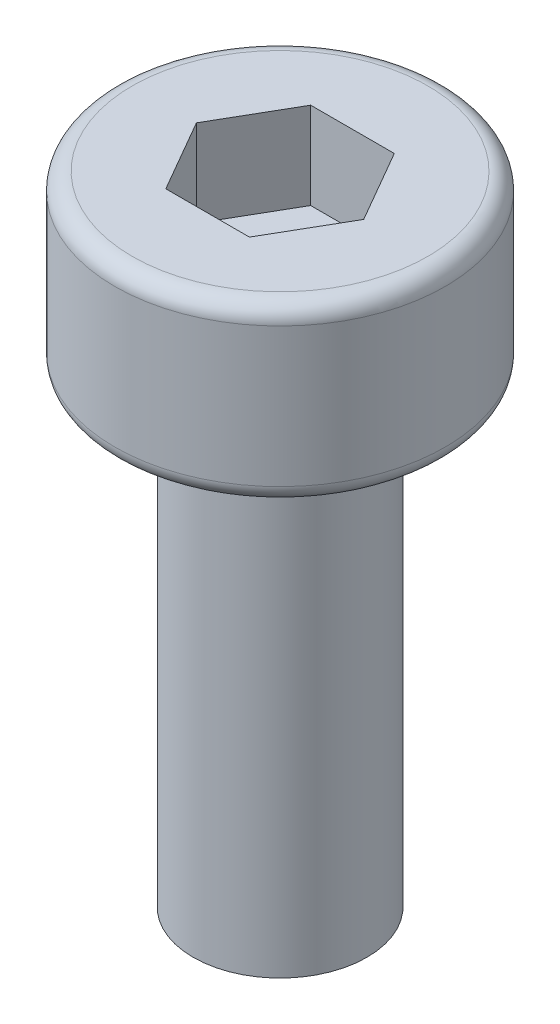
ISO-10303-21;
HEADER;
FILE_DESCRIPTION(('STEP AP214'),'2;1');
FILE_NAME('part.step','',(''),(''),'','','');
FILE_SCHEMA(('AUTOMOTIVE_DESIGN { 1 0 10303 214 1 1 1 1 }'));
ENDSEC;
DATA;
#1=APPLICATION_CONTEXT('core data for automotive mechanical design processes');
#2=APPLICATION_PROTOCOL_DEFINITION('international standard','automotive_design',2000,#1);
#3=PRODUCT_CONTEXT('',#1,'mechanical');
#4=PRODUCT('Part','Part','',(#3));
#5=PRODUCT_RELATED_PRODUCT_CATEGORY('part','',(#4));
#6=PRODUCT_DEFINITION_FORMATION('','',#4);
#7=PRODUCT_DEFINITION_CONTEXT('part definition',#1,'design');
#8=PRODUCT_DEFINITION('design','',#6,#7);
#9=PRODUCT_DEFINITION_SHAPE('','',#8);
#10=(LENGTH_UNIT() NAMED_UNIT(*) SI_UNIT(.MILLI.,.METRE.));
#11=(NAMED_UNIT(*) PLANE_ANGLE_UNIT() SI_UNIT($,.RADIAN.));
#12=(NAMED_UNIT(*) SI_UNIT($,.STERADIAN.) SOLID_ANGLE_UNIT());
#13=UNCERTAINTY_MEASURE_WITH_UNIT(LENGTH_MEASURE(1.E-05),#10,'distance_accuracy_value','');
#14=(GEOMETRIC_REPRESENTATION_CONTEXT(3) GLOBAL_UNCERTAINTY_ASSIGNED_CONTEXT((#13)) GLOBAL_UNIT_ASSIGNED_CONTEXT((#10,
#11,#12)) REPRESENTATION_CONTEXT('',''));
#15=CARTESIAN_POINT('',(0.,0.,0.));
#16=DIRECTION('',(0.,0.,1.));
#17=DIRECTION('',(1.,0.,0.));
#18=AXIS2_PLACEMENT_3D('',#15,#16,#17);
#19=CARTESIAN_POINT('',(0.,3.,0.));
#20=DIRECTION('',(0.,-1.,0.));
#21=DIRECTION('',(0.,0.,-1.));
#22=AXIS2_PLACEMENT_3D('',#19,#20,#21);
#23=CYLINDRICAL_SURFACE('',#22,2.85);
#24=CARTESIAN_POINT('',(0.,0.3,0.));
#25=DIRECTION('',(0.,1.,0.));
#26=DIRECTION('',(0.,0.,1.));
#27=AXIS2_PLACEMENT_3D('',#24,#25,#26);
#28=CIRCLE('',#27,2.85);
#29=CARTESIAN_POINT('',(0.,0.3,2.85));
#30=VERTEX_POINT('',#29);
#31=EDGE_CURVE('E152',#30,#30,#28,.T.);
#32=ORIENTED_EDGE('',*,*,#31,.T.);
#33=EDGE_LOOP('',(#32));
#34=FACE_BOUND('',#33,.T.);
#35=CARTESIAN_POINT('',(0.,2.7,0.));
#36=DIRECTION('',(0.,1.,0.));
#37=DIRECTION('',(0.,0.,1.));
#38=AXIS2_PLACEMENT_3D('',#35,#36,#37);
#39=CIRCLE('',#38,2.85);
#40=CARTESIAN_POINT('',(0.,2.7,2.85));
#41=VERTEX_POINT('',#40);
#42=EDGE_CURVE('E149',#41,#41,#39,.F.);
#43=ORIENTED_EDGE('',*,*,#42,.T.);
#44=EDGE_LOOP('',(#43));
#45=FACE_BOUND('',#44,.T.);
#46=ADVANCED_FACE('F36',(#34,#45),#23,.T.);
#47=CARTESIAN_POINT('',(0.,3.,0.));
#48=DIRECTION('',(0.,1.,0.));
#49=DIRECTION('',(0.,0.,1.));
#50=AXIS2_PLACEMENT_3D('',#47,#48,#49);
#51=PLANE('',#50);
#52=DIRECTION('',(-0.5,0.,0.866025403784439));
#53=VECTOR('',#52,1.);
#54=CARTESIAN_POINT('',(-0.721687836487033,3.,-1.25));
#55=LINE('',#54,#53);
#56=CARTESIAN_POINT('',(-0.721687836487033,3.,-1.25));
#57=VERTEX_POINT('',#56);
#58=CARTESIAN_POINT('',(-1.44337567297406,3.,0.));
#59=VERTEX_POINT('',#58);
#60=EDGE_CURVE('E51',#57,#59,#55,.T.);
#61=ORIENTED_EDGE('',*,*,#60,.F.);
#62=DIRECTION('',(-1.,0.,0.));
#63=VECTOR('',#62,1.);
#64=CARTESIAN_POINT('',(0.721687836487032,3.,-1.25));
#65=LINE('',#64,#63);
#66=CARTESIAN_POINT('',(0.721687836487032,3.,-1.25));
#67=VERTEX_POINT('',#66);
#68=EDGE_CURVE('E134',#67,#57,#65,.T.);
#69=ORIENTED_EDGE('',*,*,#68,.F.);
#70=DIRECTION('',(-0.5,0.,-0.866025403784439));
#71=VECTOR('',#70,1.);
#72=CARTESIAN_POINT('',(1.44337567297406,3.,0.));
#73=LINE('',#72,#71);
#74=CARTESIAN_POINT('',(1.44337567297406,3.,0.));
#75=VERTEX_POINT('',#74);
#76=EDGE_CURVE('E132',#75,#67,#73,.T.);
#77=ORIENTED_EDGE('',*,*,#76,.F.);
#78=DIRECTION('',(0.5,0.,-0.866025403784439));
#79=VECTOR('',#78,1.);
#80=CARTESIAN_POINT('',(0.721687836487033,3.,1.25));
#81=LINE('',#80,#79);
#82=CARTESIAN_POINT('',(0.721687836487033,3.,1.25));
#83=VERTEX_POINT('',#82);
#84=EDGE_CURVE('E99',#83,#75,#81,.T.);
#85=ORIENTED_EDGE('',*,*,#84,.F.);
#86=DIRECTION('',(1.,0.,0.));
#87=VECTOR('',#86,1.);
#88=CARTESIAN_POINT('',(-0.721687836487032,3.,1.25));
#89=LINE('',#88,#87);
#90=CARTESIAN_POINT('',(-0.721687836487032,3.,1.25));
#91=VERTEX_POINT('',#90);
#92=EDGE_CURVE('E128',#91,#83,#89,.T.);
#93=ORIENTED_EDGE('',*,*,#92,.F.);
#94=DIRECTION('',(0.5,0.,0.866025403784439));
#95=VECTOR('',#94,1.);
#96=CARTESIAN_POINT('',(-1.44337567297406,3.,0.));
#97=LINE('',#96,#95);
#98=EDGE_CURVE('E125',#59,#91,#97,.T.);
#99=ORIENTED_EDGE('',*,*,#98,.F.);
#100=EDGE_LOOP('',(#61,#69,#77,#85,#93,#99));
#101=FACE_BOUND('',#100,.T.);
#102=CARTESIAN_POINT('',(0.,3.,0.));
#103=DIRECTION('',(0.,1.,0.));
#104=DIRECTION('',(0.,0.,1.));
#105=AXIS2_PLACEMENT_3D('',#102,#103,#104);
#106=CIRCLE('',#105,2.55);
#107=CARTESIAN_POINT('',(0.,3.,2.55));
#108=VERTEX_POINT('',#107);
#109=EDGE_CURVE('E11',#108,#108,#106,.T.);
#110=ORIENTED_EDGE('',*,*,#109,.T.);
#111=EDGE_LOOP('',(#110));
#112=FACE_BOUND('',#111,.T.);
#113=ADVANCED_FACE('F168',(#101,#112),#51,.T.);
#114=CARTESIAN_POINT('',(0.,0.,0.));
#115=DIRECTION('',(0.,1.,0.));
#116=DIRECTION('',(0.,0.,1.));
#117=AXIS2_PLACEMENT_3D('',#114,#115,#116);
#118=PLANE('',#117);
#119=CARTESIAN_POINT('',(0.,0.,0.));
#120=DIRECTION('',(0.,1.,0.));
#121=DIRECTION('',(0.,0.,1.));
#122=AXIS2_PLACEMENT_3D('',#119,#120,#121);
#123=CIRCLE('',#122,2.55);
#124=CARTESIAN_POINT('',(0.,0.,2.55));
#125=VERTEX_POINT('',#124);
#126=EDGE_CURVE('E44',#125,#125,#123,.F.);
#127=ORIENTED_EDGE('',*,*,#126,.T.);
#128=EDGE_LOOP('',(#127));
#129=FACE_BOUND('',#128,.T.);
#130=CARTESIAN_POINT('',(0.,0.,0.));
#131=DIRECTION('',(0.,1.,0.));
#132=DIRECTION('',(0.,0.,1.));
#133=AXIS2_PLACEMENT_3D('',#130,#131,#132);
#134=CIRCLE('',#133,1.5);
#135=CARTESIAN_POINT('',(0.,0.,1.5));
#136=VERTEX_POINT('',#135);
#137=EDGE_CURVE('E146',#136,#136,#134,.F.);
#138=ORIENTED_EDGE('',*,*,#137,.F.);
#139=EDGE_LOOP('',(#138));
#140=FACE_BOUND('',#139,.T.);
#141=ADVANCED_FACE('F157',(#129,#140),#118,.F.);
#142=CARTESIAN_POINT('',(0.,-8.,0.));
#143=DIRECTION('',(0.,1.,0.));
#144=DIRECTION('',(0.,0.,1.));
#145=AXIS2_PLACEMENT_3D('',#142,#143,#144);
#146=CYLINDRICAL_SURFACE('',#145,1.5);
#147=CARTESIAN_POINT('',(0.,-8.,0.));
#148=DIRECTION('',(0.,-1.,0.));
#149=DIRECTION('',(0.,0.,-1.));
#150=AXIS2_PLACEMENT_3D('',#147,#148,#149);
#151=CIRCLE('',#150,1.5);
#152=CARTESIAN_POINT('',(0.,-8.,-1.5));
#153=VERTEX_POINT('',#152);
#154=EDGE_CURVE('E138',#153,#153,#151,.T.);
#155=ORIENTED_EDGE('',*,*,#154,.F.);
#156=EDGE_LOOP('',(#155));
#157=FACE_BOUND('',#156,.T.);
#158=ORIENTED_EDGE('',*,*,#137,.T.);
#159=EDGE_LOOP('',(#158));
#160=FACE_BOUND('',#159,.T.);
#161=ADVANCED_FACE('F183',(#157,#160),#146,.T.);
#162=CARTESIAN_POINT('',(0.,-8.,0.));
#163=DIRECTION('',(0.,-1.,0.));
#164=DIRECTION('',(0.,0.,-1.));
#165=AXIS2_PLACEMENT_3D('',#162,#163,#164);
#166=PLANE('',#165);
#167=ORIENTED_EDGE('',*,*,#154,.T.);
#168=EDGE_LOOP('',(#167));
#169=FACE_BOUND('',#168,.T.);
#170=ADVANCED_FACE('F163',(#169),#166,.T.);
#171=CARTESIAN_POINT('',(0.,0.3,0.));
#172=DIRECTION('',(0.,1.,0.));
#173=DIRECTION('',(0.,0.,1.));
#174=AXIS2_PLACEMENT_3D('',#171,#172,#173);
#175=TOROIDAL_SURFACE('',#174,2.55,0.3);
#176=ORIENTED_EDGE('',*,*,#126,.F.);
#177=EDGE_LOOP('',(#176));
#178=FACE_BOUND('',#177,.T.);
#179=ORIENTED_EDGE('',*,*,#31,.F.);
#180=EDGE_LOOP('',(#179));
#181=FACE_BOUND('',#180,.T.);
#182=ADVANCED_FACE('F160',(#178,#181),#175,.T.);
#183=CARTESIAN_POINT('',(0.,2.7,0.));
#184=DIRECTION('',(0.,1.,0.));
#185=DIRECTION('',(0.,0.,1.));
#186=AXIS2_PLACEMENT_3D('',#183,#184,#185);
#187=TOROIDAL_SURFACE('',#186,2.55,0.3);
#188=ORIENTED_EDGE('',*,*,#42,.F.);
#189=EDGE_LOOP('',(#188));
#190=FACE_BOUND('',#189,.T.);
#191=ORIENTED_EDGE('',*,*,#109,.F.);
#192=EDGE_LOOP('',(#191));
#193=FACE_BOUND('',#192,.T.);
#194=ADVANCED_FACE('F38',(#190,#193),#187,.T.);
#195=CARTESIAN_POINT('',(-0.721687836487033,1.5,-1.25));
#196=DIRECTION('',(-0.866025403784439,0.,-0.5));
#197=DIRECTION('',(-0.5,0.,0.866025403784439));
#198=AXIS2_PLACEMENT_3D('',#195,#196,#197);
#199=PLANE('',#198);
#200=ORIENTED_EDGE('',*,*,#60,.T.);
#201=DIRECTION('',(0.,1.,0.));
#202=VECTOR('',#201,1.);
#203=CARTESIAN_POINT('',(-1.44337567297406,1.5,0.));
#204=LINE('',#203,#202);
#205=CARTESIAN_POINT('',(-1.44337567297406,1.5,0.));
#206=VERTEX_POINT('',#205);
#207=EDGE_CURVE('E81',#206,#59,#204,.T.);
#208=ORIENTED_EDGE('',*,*,#207,.F.);
#209=DIRECTION('',(-0.5,0.,0.866025403784439));
#210=VECTOR('',#209,1.);
#211=CARTESIAN_POINT('',(-0.721687836487033,1.5,-1.25));
#212=LINE('',#211,#210);
#213=CARTESIAN_POINT('',(-0.721687836487033,1.5,-1.25));
#214=VERTEX_POINT('',#213);
#215=EDGE_CURVE('E136',#214,#206,#212,.T.);
#216=ORIENTED_EDGE('',*,*,#215,.F.);
#217=DIRECTION('',(0.,1.,0.));
#218=VECTOR('',#217,1.);
#219=CARTESIAN_POINT('',(-0.721687836487033,1.5,-1.25));
#220=LINE('',#219,#218);
#221=EDGE_CURVE('E59',#214,#57,#220,.T.);
#222=ORIENTED_EDGE('',*,*,#221,.T.);
#223=EDGE_LOOP('',(#200,#208,#216,#222));
#224=FACE_BOUND('',#223,.T.);
#225=ADVANCED_FACE('F174',(#224),#199,.F.);
#226=CARTESIAN_POINT('',(0.721687836487032,1.5,-1.25));
#227=DIRECTION('',(0.,0.,-1.));
#228=DIRECTION('',(-1.,0.,0.));
#229=AXIS2_PLACEMENT_3D('',#226,#227,#228);
#230=PLANE('',#229);
#231=ORIENTED_EDGE('',*,*,#68,.T.);
#232=ORIENTED_EDGE('',*,*,#221,.F.);
#233=DIRECTION('',(-1.,0.,0.));
#234=VECTOR('',#233,1.);
#235=CARTESIAN_POINT('',(0.721687836487032,1.5,-1.25));
#236=LINE('',#235,#234);
#237=CARTESIAN_POINT('',(0.721687836487032,1.5,-1.25));
#238=VERTEX_POINT('',#237);
#239=EDGE_CURVE('E111',#238,#214,#236,.T.);
#240=ORIENTED_EDGE('',*,*,#239,.F.);
#241=DIRECTION('',(0.,1.,0.));
#242=VECTOR('',#241,1.);
#243=CARTESIAN_POINT('',(0.721687836487032,1.5,-1.25));
#244=LINE('',#243,#242);
#245=EDGE_CURVE('E103',#238,#67,#244,.T.);
#246=ORIENTED_EDGE('',*,*,#245,.T.);
#247=EDGE_LOOP('',(#231,#232,#240,#246));
#248=FACE_BOUND('',#247,.T.);
#249=ADVANCED_FACE('F194',(#248),#230,.F.);
#250=CARTESIAN_POINT('',(1.44337567297406,1.5,0.));
#251=DIRECTION('',(0.866025403784438,0.,-0.5));
#252=DIRECTION('',(-0.5,0.,-0.866025403784439));
#253=AXIS2_PLACEMENT_3D('',#250,#251,#252);
#254=PLANE('',#253);
#255=ORIENTED_EDGE('',*,*,#76,.T.);
#256=ORIENTED_EDGE('',*,*,#245,.F.);
#257=DIRECTION('',(-0.5,0.,-0.866025403784439));
#258=VECTOR('',#257,1.);
#259=CARTESIAN_POINT('',(1.44337567297406,1.5,0.));
#260=LINE('',#259,#258);
#261=CARTESIAN_POINT('',(1.44337567297406,1.5,0.));
#262=VERTEX_POINT('',#261);
#263=EDGE_CURVE('E107',#262,#238,#260,.T.);
#264=ORIENTED_EDGE('',*,*,#263,.F.);
#265=DIRECTION('',(0.,1.,0.));
#266=VECTOR('',#265,1.);
#267=CARTESIAN_POINT('',(1.44337567297406,1.5,0.));
#268=LINE('',#267,#266);
#269=EDGE_CURVE('E92',#262,#75,#268,.T.);
#270=ORIENTED_EDGE('',*,*,#269,.T.);
#271=EDGE_LOOP('',(#255,#256,#264,#270));
#272=FACE_BOUND('',#271,.T.);
#273=ADVANCED_FACE('F108',(#272),#254,.F.);
#274=CARTESIAN_POINT('',(0.721687836487033,1.5,1.25));
#275=DIRECTION('',(0.866025403784439,0.,0.5));
#276=DIRECTION('',(0.5,0.,-0.866025403784439));
#277=AXIS2_PLACEMENT_3D('',#274,#275,#276);
#278=PLANE('',#277);
#279=ORIENTED_EDGE('',*,*,#84,.T.);
#280=ORIENTED_EDGE('',*,*,#269,.F.);
#281=DIRECTION('',(0.5,0.,-0.866025403784439));
#282=VECTOR('',#281,1.);
#283=CARTESIAN_POINT('',(0.721687836487033,1.5,1.25));
#284=LINE('',#283,#282);
#285=CARTESIAN_POINT('',(0.721687836487033,1.5,1.25));
#286=VERTEX_POINT('',#285);
#287=EDGE_CURVE('E96',#286,#262,#284,.T.);
#288=ORIENTED_EDGE('',*,*,#287,.F.);
#289=DIRECTION('',(0.,1.,0.));
#290=VECTOR('',#289,1.);
#291=CARTESIAN_POINT('',(0.721687836487033,1.5,1.25));
#292=LINE('',#291,#290);
#293=EDGE_CURVE('E104',#286,#83,#292,.T.);
#294=ORIENTED_EDGE('',*,*,#293,.T.);
#295=EDGE_LOOP('',(#279,#280,#288,#294));
#296=FACE_BOUND('',#295,.T.);
#297=ADVANCED_FACE('F94',(#296),#278,.F.);
#298=CARTESIAN_POINT('',(-0.721687836487032,1.5,1.25));
#299=DIRECTION('',(0.,0.,1.));
#300=DIRECTION('',(1.,0.,0.));
#301=AXIS2_PLACEMENT_3D('',#298,#299,#300);
#302=PLANE('',#301);
#303=ORIENTED_EDGE('',*,*,#92,.T.);
#304=ORIENTED_EDGE('',*,*,#293,.F.);
#305=DIRECTION('',(1.,0.,0.));
#306=VECTOR('',#305,1.);
#307=CARTESIAN_POINT('',(-0.721687836487032,1.5,1.25));
#308=LINE('',#307,#306);
#309=CARTESIAN_POINT('',(-0.721687836487032,1.5,1.25));
#310=VERTEX_POINT('',#309);
#311=EDGE_CURVE('E117',#310,#286,#308,.T.);
#312=ORIENTED_EDGE('',*,*,#311,.F.);
#313=DIRECTION('',(0.,1.,0.));
#314=VECTOR('',#313,1.);
#315=CARTESIAN_POINT('',(-0.721687836487032,1.5,1.25));
#316=LINE('',#315,#314);
#317=EDGE_CURVE('E141',#310,#91,#316,.T.);
#318=ORIENTED_EDGE('',*,*,#317,.T.);
#319=EDGE_LOOP('',(#303,#304,#312,#318));
#320=FACE_BOUND('',#319,.T.);
#321=ADVANCED_FACE('F198',(#320),#302,.F.);
#322=CARTESIAN_POINT('',(-1.44337567297406,1.5,0.));
#323=DIRECTION('',(-0.866025403784439,0.,0.5));
#324=DIRECTION('',(0.5,0.,0.866025403784439));
#325=AXIS2_PLACEMENT_3D('',#322,#323,#324);
#326=PLANE('',#325);
#327=ORIENTED_EDGE('',*,*,#98,.T.);
#328=ORIENTED_EDGE('',*,*,#317,.F.);
#329=DIRECTION('',(0.5,0.,0.866025403784439));
#330=VECTOR('',#329,1.);
#331=CARTESIAN_POINT('',(-1.44337567297406,1.5,0.));
#332=LINE('',#331,#330);
#333=EDGE_CURVE('E119',#206,#310,#332,.T.);
#334=ORIENTED_EDGE('',*,*,#333,.F.);
#335=ORIENTED_EDGE('',*,*,#207,.T.);
#336=EDGE_LOOP('',(#327,#328,#334,#335));
#337=FACE_BOUND('',#336,.T.);
#338=ADVANCED_FACE('F195',(#337),#326,.F.);
#339=CARTESIAN_POINT('',(0.,1.5,0.));
#340=DIRECTION('',(0.,1.,0.));
#341=DIRECTION('',(0.,0.,1.));
#342=AXIS2_PLACEMENT_3D('',#339,#340,#341);
#343=PLANE('',#342);
#344=ORIENTED_EDGE('',*,*,#215,.T.);
#345=ORIENTED_EDGE('',*,*,#333,.T.);
#346=ORIENTED_EDGE('',*,*,#311,.T.);
#347=ORIENTED_EDGE('',*,*,#287,.T.);
#348=ORIENTED_EDGE('',*,*,#263,.T.);
#349=ORIENTED_EDGE('',*,*,#239,.T.);
#350=EDGE_LOOP('',(#344,#345,#346,#347,#348,#349));
#351=FACE_BOUND('',#350,.T.);
#352=ADVANCED_FACE('F114',(#351),#343,.T.);
#353=CLOSED_SHELL('',(#46,#113,#141,#161,#170,#182,#194,#225,#249,#273,#297,#321,#338,#352));
#354=MANIFOLD_SOLID_BREP('B2',#353);
#355=ADVANCED_BREP_SHAPE_REPRESENTATION('',(#18,#354),#14);
#356=SHAPE_DEFINITION_REPRESENTATION(#9,#355);
ENDSEC;
END-ISO-10303-21;
